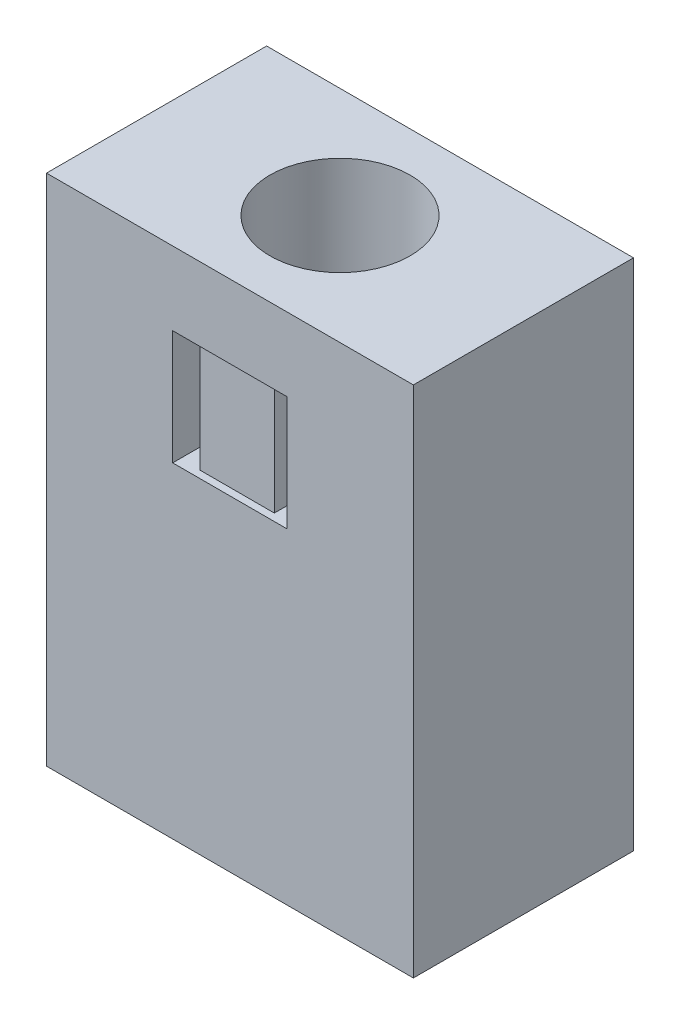
ISO-10303-21;
HEADER;
FILE_DESCRIPTION(('STEP AP214'),'2;1');
FILE_NAME('part.step','',(''),(''),'','','');
FILE_SCHEMA(('AUTOMOTIVE_DESIGN { 1 0 10303 214 1 1 1 1 }'));
ENDSEC;
DATA;
#1=APPLICATION_CONTEXT('core data for automotive mechanical design processes');
#2=APPLICATION_PROTOCOL_DEFINITION('international standard','automotive_design',2000,#1);
#3=PRODUCT_CONTEXT('',#1,'mechanical');
#4=PRODUCT('Part','Part','',(#3));
#5=PRODUCT_RELATED_PRODUCT_CATEGORY('part','',(#4));
#6=PRODUCT_DEFINITION_FORMATION('','',#4);
#7=PRODUCT_DEFINITION_CONTEXT('part definition',#1,'design');
#8=PRODUCT_DEFINITION('design','',#6,#7);
#9=PRODUCT_DEFINITION_SHAPE('','',#8);
#10=(LENGTH_UNIT() NAMED_UNIT(*) SI_UNIT(.MILLI.,.METRE.));
#11=(NAMED_UNIT(*) PLANE_ANGLE_UNIT() SI_UNIT($,.RADIAN.));
#12=(NAMED_UNIT(*) SI_UNIT($,.STERADIAN.) SOLID_ANGLE_UNIT());
#13=UNCERTAINTY_MEASURE_WITH_UNIT(LENGTH_MEASURE(1.E-05),#10,'distance_accuracy_value','');
#14=(GEOMETRIC_REPRESENTATION_CONTEXT(3) GLOBAL_UNCERTAINTY_ASSIGNED_CONTEXT((#13)) GLOBAL_UNIT_ASSIGNED_CONTEXT((#10,
#11,#12)) REPRESENTATION_CONTEXT('',''));
#15=CARTESIAN_POINT('',(0.,0.,0.));
#16=DIRECTION('',(0.,0.,1.));
#17=DIRECTION('',(1.,0.,0.));
#18=AXIS2_PLACEMENT_3D('',#15,#16,#17);
#19=CARTESIAN_POINT('',(0.,0.,14.));
#20=DIRECTION('',(0.,0.,-1.));
#21=DIRECTION('',(-1.,0.,0.));
#22=AXIS2_PLACEMENT_3D('',#19,#20,#21);
#23=PLANE('',#22);
#24=DIRECTION('',(0.,-1.,0.));
#25=VECTOR('',#24,1.);
#26=CARTESIAN_POINT('',(5.05000000000001,60.,14.));
#27=LINE('',#26,#25);
#28=CARTESIAN_POINT('',(5.05000000000001,60.,14.));
#29=VERTEX_POINT('',#28);
#30=CARTESIAN_POINT('',(5.05000000000001,44.4,14.));
#31=VERTEX_POINT('',#30);
#32=EDGE_CURVE('E165',#29,#31,#27,.T.);
#33=ORIENTED_EDGE('',*,*,#32,.F.);
#34=DIRECTION('',(-1.,0.,0.));
#35=VECTOR('',#34,1.);
#36=CARTESIAN_POINT('',(-7.80000000000001,60.,14.));
#37=LINE('',#36,#35);
#38=CARTESIAN_POINT('',(-5.04999999999999,60.,14.));
#39=VERTEX_POINT('',#38);
#40=EDGE_CURVE('E204',#29,#39,#37,.T.);
#41=ORIENTED_EDGE('',*,*,#40,.T.);
#42=DIRECTION('',(0.,1.,0.));
#43=VECTOR('',#42,1.);
#44=CARTESIAN_POINT('',(-5.04999999999999,60.,14.));
#45=LINE('',#44,#43);
#46=CARTESIAN_POINT('',(-5.04999999999999,44.4,14.));
#47=VERTEX_POINT('',#46);
#48=EDGE_CURVE('E168',#47,#39,#45,.T.);
#49=ORIENTED_EDGE('',*,*,#48,.F.);
#50=DIRECTION('',(1.,0.,0.));
#51=VECTOR('',#50,1.);
#52=CARTESIAN_POINT('',(-7.80000000000001,44.4,14.));
#53=LINE('',#52,#51);
#54=EDGE_CURVE('E208',#47,#31,#53,.T.);
#55=ORIENTED_EDGE('',*,*,#54,.T.);
#56=EDGE_LOOP('',(#33,#41,#49,#55));
#57=FACE_BOUND('',#56,.T.);
#58=ADVANCED_FACE('F45',(#57),#23,.F.);
#59=CARTESIAN_POINT('',(25.,70.,15.));
#60=DIRECTION('',(-1.,0.,0.));
#61=DIRECTION('',(0.,0.,1.));
#62=AXIS2_PLACEMENT_3D('',#59,#60,#61);
#63=PLANE('',#62);
#64=DIRECTION('',(0.,0.,-1.));
#65=VECTOR('',#64,1.);
#66=CARTESIAN_POINT('',(25.,0.,15.));
#67=LINE('',#66,#65);
#68=CARTESIAN_POINT('',(25.,0.,15.));
#69=VERTEX_POINT('',#68);
#70=CARTESIAN_POINT('',(25.,0.,-15.));
#71=VERTEX_POINT('',#70);
#72=EDGE_CURVE('E238',#69,#71,#67,.T.);
#73=ORIENTED_EDGE('',*,*,#72,.T.);
#74=DIRECTION('',(0.,-1.,0.));
#75=VECTOR('',#74,1.);
#76=CARTESIAN_POINT('',(25.,70.,-15.));
#77=LINE('',#76,#75);
#78=CARTESIAN_POINT('',(25.,70.,-15.));
#79=VERTEX_POINT('',#78);
#80=EDGE_CURVE('E11',#79,#71,#77,.T.);
#81=ORIENTED_EDGE('',*,*,#80,.F.);
#82=DIRECTION('',(0.,0.,-1.));
#83=VECTOR('',#82,1.);
#84=CARTESIAN_POINT('',(25.,70.,15.));
#85=LINE('',#84,#83);
#86=CARTESIAN_POINT('',(25.,70.,15.));
#87=VERTEX_POINT('',#86);
#88=EDGE_CURVE('E239',#87,#79,#85,.T.);
#89=ORIENTED_EDGE('',*,*,#88,.F.);
#90=DIRECTION('',(0.,-1.,0.));
#91=VECTOR('',#90,1.);
#92=CARTESIAN_POINT('',(25.,70.,15.));
#93=LINE('',#92,#91);
#94=EDGE_CURVE('E253',#87,#69,#93,.T.);
#95=ORIENTED_EDGE('',*,*,#94,.T.);
#96=EDGE_LOOP('',(#73,#81,#89,#95));
#97=FACE_BOUND('',#96,.T.);
#98=ADVANCED_FACE('F47',(#97),#63,.F.);
#99=CARTESIAN_POINT('',(-25.,70.,-15.));
#100=DIRECTION('',(0.,0.,1.));
#101=DIRECTION('',(1.,0.,0.));
#102=AXIS2_PLACEMENT_3D('',#99,#100,#101);
#103=PLANE('',#102);
#104=DIRECTION('',(-1.,0.,0.));
#105=VECTOR('',#104,1.);
#106=CARTESIAN_POINT('',(-25.,0.,-15.));
#107=LINE('',#106,#105);
#108=CARTESIAN_POINT('',(-25.,0.,-15.));
#109=VERTEX_POINT('',#108);
#110=EDGE_CURVE('E257',#71,#109,#107,.T.);
#111=ORIENTED_EDGE('',*,*,#110,.T.);
#112=DIRECTION('',(0.,-1.,0.));
#113=VECTOR('',#112,1.);
#114=CARTESIAN_POINT('',(-25.,70.,-15.));
#115=LINE('',#114,#113);
#116=CARTESIAN_POINT('',(-25.,70.,-15.));
#117=VERTEX_POINT('',#116);
#118=EDGE_CURVE('E54',#117,#109,#115,.T.);
#119=ORIENTED_EDGE('',*,*,#118,.F.);
#120=DIRECTION('',(-1.,0.,0.));
#121=VECTOR('',#120,1.);
#122=CARTESIAN_POINT('',(-25.,70.,-15.));
#123=LINE('',#122,#121);
#124=EDGE_CURVE('E243',#79,#117,#123,.T.);
#125=ORIENTED_EDGE('',*,*,#124,.F.);
#126=ORIENTED_EDGE('',*,*,#80,.T.);
#127=EDGE_LOOP('',(#111,#119,#125,#126));
#128=FACE_BOUND('',#127,.T.);
#129=ADVANCED_FACE('F293',(#128),#103,.F.);
#130=CARTESIAN_POINT('',(-25.,70.,15.));
#131=DIRECTION('',(1.,0.,0.));
#132=DIRECTION('',(0.,0.,-1.));
#133=AXIS2_PLACEMENT_3D('',#130,#131,#132);
#134=PLANE('',#133);
#135=DIRECTION('',(0.,0.,1.));
#136=VECTOR('',#135,1.);
#137=CARTESIAN_POINT('',(-25.,0.,15.));
#138=LINE('',#137,#136);
#139=CARTESIAN_POINT('',(-25.,0.,15.));
#140=VERTEX_POINT('',#139);
#141=EDGE_CURVE('E260',#109,#140,#138,.T.);
#142=ORIENTED_EDGE('',*,*,#141,.T.);
#143=DIRECTION('',(0.,-1.,0.));
#144=VECTOR('',#143,1.);
#145=CARTESIAN_POINT('',(-25.,70.,15.));
#146=LINE('',#145,#144);
#147=CARTESIAN_POINT('',(-25.,70.,15.));
#148=VERTEX_POINT('',#147);
#149=EDGE_CURVE('E268',#148,#140,#146,.T.);
#150=ORIENTED_EDGE('',*,*,#149,.F.);
#151=DIRECTION('',(0.,0.,1.));
#152=VECTOR('',#151,1.);
#153=CARTESIAN_POINT('',(-25.,70.,15.));
#154=LINE('',#153,#152);
#155=EDGE_CURVE('E247',#117,#148,#154,.T.);
#156=ORIENTED_EDGE('',*,*,#155,.F.);
#157=ORIENTED_EDGE('',*,*,#118,.T.);
#158=EDGE_LOOP('',(#142,#150,#156,#157));
#159=FACE_BOUND('',#158,.T.);
#160=ADVANCED_FACE('F277',(#159),#134,.F.);
#161=CARTESIAN_POINT('',(-25.,70.,15.));
#162=DIRECTION('',(0.,0.,-1.));
#163=DIRECTION('',(-1.,0.,0.));
#164=AXIS2_PLACEMENT_3D('',#161,#162,#163);
#165=PLANE('',#164);
#166=DIRECTION('',(-1.,0.,0.));
#167=VECTOR('',#166,1.);
#168=CARTESIAN_POINT('',(-7.80000000000001,60.,15.));
#169=LINE('',#168,#167);
#170=CARTESIAN_POINT('',(7.79999999999998,60.,15.));
#171=VERTEX_POINT('',#170);
#172=CARTESIAN_POINT('',(-7.80000000000001,60.,15.));
#173=VERTEX_POINT('',#172);
#174=EDGE_CURVE('E214',#171,#173,#169,.T.);
#175=ORIENTED_EDGE('',*,*,#174,.F.);
#176=DIRECTION('',(0.,1.,0.));
#177=VECTOR('',#176,1.);
#178=CARTESIAN_POINT('',(7.79999999999999,44.4,15.));
#179=LINE('',#178,#177);
#180=CARTESIAN_POINT('',(7.79999999999999,44.4,15.));
#181=VERTEX_POINT('',#180);
#182=EDGE_CURVE('E178',#181,#171,#179,.T.);
#183=ORIENTED_EDGE('',*,*,#182,.F.);
#184=DIRECTION('',(1.,0.,0.));
#185=VECTOR('',#184,1.);
#186=CARTESIAN_POINT('',(-7.80000000000001,44.4,15.));
#187=LINE('',#186,#185);
#188=CARTESIAN_POINT('',(-7.80000000000001,44.4,15.));
#189=VERTEX_POINT('',#188);
#190=EDGE_CURVE('E144',#189,#181,#187,.T.);
#191=ORIENTED_EDGE('',*,*,#190,.F.);
#192=DIRECTION('',(0.,-1.,0.));
#193=VECTOR('',#192,1.);
#194=CARTESIAN_POINT('',(-7.80000000000001,44.4,15.));
#195=LINE('',#194,#193);
#196=EDGE_CURVE('E218',#173,#189,#195,.T.);
#197=ORIENTED_EDGE('',*,*,#196,.F.);
#198=EDGE_LOOP('',(#175,#183,#191,#197));
#199=FACE_BOUND('',#198,.T.);
#200=DIRECTION('',(1.,0.,0.));
#201=VECTOR('',#200,1.);
#202=CARTESIAN_POINT('',(-25.,0.,15.));
#203=LINE('',#202,#201);
#204=EDGE_CURVE('E244',#140,#69,#203,.T.);
#205=ORIENTED_EDGE('',*,*,#204,.T.);
#206=ORIENTED_EDGE('',*,*,#94,.F.);
#207=DIRECTION('',(1.,0.,0.));
#208=VECTOR('',#207,1.);
#209=CARTESIAN_POINT('',(-25.,70.,15.));
#210=LINE('',#209,#208);
#211=EDGE_CURVE('E250',#148,#87,#210,.T.);
#212=ORIENTED_EDGE('',*,*,#211,.F.);
#213=ORIENTED_EDGE('',*,*,#149,.T.);
#214=EDGE_LOOP('',(#205,#206,#212,#213));
#215=FACE_BOUND('',#214,.T.);
#216=ADVANCED_FACE('F286',(#199,#215),#165,.F.);
#217=CARTESIAN_POINT('',(0.,70.,0.));
#218=DIRECTION('',(0.,-1.,0.));
#219=DIRECTION('',(0.,0.,-1.));
#220=AXIS2_PLACEMENT_3D('',#217,#218,#219);
#221=PLANE('',#220);
#222=CARTESIAN_POINT('',(0.,70.,0.));
#223=DIRECTION('',(0.,-1.,0.));
#224=DIRECTION('',(0.,0.,-1.));
#225=AXIS2_PLACEMENT_3D('',#222,#223,#224);
#226=CIRCLE('',#225,9.55);
#227=CARTESIAN_POINT('',(0.,70.,-9.55));
#228=VERTEX_POINT('',#227);
#229=EDGE_CURVE('E234',#228,#228,#226,.T.);
#230=ORIENTED_EDGE('',*,*,#229,.T.);
#231=EDGE_LOOP('',(#230));
#232=FACE_BOUND('',#231,.T.);
#233=ORIENTED_EDGE('',*,*,#88,.T.);
#234=ORIENTED_EDGE('',*,*,#124,.T.);
#235=ORIENTED_EDGE('',*,*,#155,.T.);
#236=ORIENTED_EDGE('',*,*,#211,.T.);
#237=EDGE_LOOP('',(#233,#234,#235,#236));
#238=FACE_BOUND('',#237,.T.);
#239=ADVANCED_FACE('F292',(#232,#238),#221,.F.);
#240=CARTESIAN_POINT('',(0.,0.,0.));
#241=DIRECTION('',(0.,-1.,0.));
#242=DIRECTION('',(0.,0.,-1.));
#243=AXIS2_PLACEMENT_3D('',#240,#241,#242);
#244=PLANE('',#243);
#245=CARTESIAN_POINT('',(0.,0.,0.));
#246=DIRECTION('',(0.,-1.,0.));
#247=DIRECTION('',(0.,0.,-1.));
#248=AXIS2_PLACEMENT_3D('',#245,#246,#247);
#249=CIRCLE('',#248,9.55);
#250=CARTESIAN_POINT('',(0.,0.,-9.55));
#251=VERTEX_POINT('',#250);
#252=EDGE_CURVE('E148',#251,#251,#249,.T.);
#253=ORIENTED_EDGE('',*,*,#252,.F.);
#254=EDGE_LOOP('',(#253));
#255=FACE_BOUND('',#254,.T.);
#256=ORIENTED_EDGE('',*,*,#72,.F.);
#257=ORIENTED_EDGE('',*,*,#204,.F.);
#258=ORIENTED_EDGE('',*,*,#141,.F.);
#259=ORIENTED_EDGE('',*,*,#110,.F.);
#260=EDGE_LOOP('',(#256,#257,#258,#259));
#261=FACE_BOUND('',#260,.T.);
#262=ADVANCED_FACE('F283',(#255,#261),#244,.T.);
#263=CARTESIAN_POINT('',(0.,120.,0.));
#264=DIRECTION('',(0.,-1.,0.));
#265=DIRECTION('',(0.,0.,-1.));
#266=AXIS2_PLACEMENT_3D('',#263,#264,#265);
#267=CYLINDRICAL_SURFACE('',#266,9.55);
#268=ORIENTED_EDGE('',*,*,#252,.T.);
#269=EDGE_LOOP('',(#268));
#270=FACE_BOUND('',#269,.T.);
#271=ORIENTED_EDGE('',*,*,#229,.F.);
#272=EDGE_LOOP('',(#271));
#273=FACE_BOUND('',#272,.T.);
#274=ADVANCED_FACE('F323',(#270,#273),#267,.F.);
#275=CARTESIAN_POINT('',(7.79999999999999,44.4,14.));
#276=DIRECTION('',(1.,0.,0.));
#277=DIRECTION('',(0.,0.,-1.));
#278=AXIS2_PLACEMENT_3D('',#275,#276,#277);
#279=PLANE('',#278);
#280=ORIENTED_EDGE('',*,*,#182,.T.);
#281=DIRECTION('',(0.,0.,1.));
#282=VECTOR('',#281,1.);
#283=CARTESIAN_POINT('',(7.79999999999999,60.,14.));
#284=LINE('',#283,#282);
#285=CARTESIAN_POINT('',(7.79999999999999,60.,11.));
#286=VERTEX_POINT('',#285);
#287=EDGE_CURVE('E155',#286,#171,#284,.T.);
#288=ORIENTED_EDGE('',*,*,#287,.F.);
#289=DIRECTION('',(0.,1.,0.));
#290=VECTOR('',#289,1.);
#291=CARTESIAN_POINT('',(7.79999999999999,60.,11.));
#292=LINE('',#291,#290);
#293=CARTESIAN_POINT('',(7.79999999999999,44.4,11.));
#294=VERTEX_POINT('',#293);
#295=EDGE_CURVE('E152',#294,#286,#292,.T.);
#296=ORIENTED_EDGE('',*,*,#295,.F.);
#297=DIRECTION('',(0.,0.,1.));
#298=VECTOR('',#297,1.);
#299=CARTESIAN_POINT('',(7.79999999999999,44.4,14.));
#300=LINE('',#299,#298);
#301=EDGE_CURVE('E137',#294,#181,#300,.T.);
#302=ORIENTED_EDGE('',*,*,#301,.T.);
#303=EDGE_LOOP('',(#280,#288,#296,#302));
#304=FACE_BOUND('',#303,.T.);
#305=ADVANCED_FACE('F153',(#304),#279,.F.);
#306=CARTESIAN_POINT('',(-7.80000000000001,44.4,14.));
#307=DIRECTION('',(0.,-1.,0.));
#308=DIRECTION('',(0.,0.,-1.));
#309=AXIS2_PLACEMENT_3D('',#306,#307,#308);
#310=PLANE('',#309);
#311=ORIENTED_EDGE('',*,*,#190,.T.);
#312=ORIENTED_EDGE('',*,*,#301,.F.);
#313=DIRECTION('',(1.,0.,0.));
#314=VECTOR('',#313,1.);
#315=CARTESIAN_POINT('',(5.05000000000001,44.4,11.));
#316=LINE('',#315,#314);
#317=CARTESIAN_POINT('',(5.05000000000001,44.4,11.));
#318=VERTEX_POINT('',#317);
#319=EDGE_CURVE('E141',#318,#294,#316,.T.);
#320=ORIENTED_EDGE('',*,*,#319,.F.);
#321=DIRECTION('',(0.,0.,1.));
#322=VECTOR('',#321,1.);
#323=CARTESIAN_POINT('',(5.05000000000001,44.4,11.));
#324=LINE('',#323,#322);
#325=EDGE_CURVE('E175',#318,#31,#324,.T.);
#326=ORIENTED_EDGE('',*,*,#325,.T.);
#327=ORIENTED_EDGE('',*,*,#54,.F.);
#328=DIRECTION('',(0.,0.,1.));
#329=VECTOR('',#328,1.);
#330=CARTESIAN_POINT('',(-5.04999999999999,44.4,11.));
#331=LINE('',#330,#329);
#332=CARTESIAN_POINT('',(-5.04999999999999,44.4,11.));
#333=VERTEX_POINT('',#332);
#334=EDGE_CURVE('E61',#333,#47,#331,.T.);
#335=ORIENTED_EDGE('',*,*,#334,.F.);
#336=DIRECTION('',(1.,0.,0.));
#337=VECTOR('',#336,1.);
#338=CARTESIAN_POINT('',(-7.80000000000001,44.4,11.));
#339=LINE('',#338,#337);
#340=CARTESIAN_POINT('',(-7.80000000000001,44.4,11.));
#341=VERTEX_POINT('',#340);
#342=EDGE_CURVE('E193',#341,#333,#339,.T.);
#343=ORIENTED_EDGE('',*,*,#342,.F.);
#344=DIRECTION('',(0.,0.,1.));
#345=VECTOR('',#344,1.);
#346=CARTESIAN_POINT('',(-7.80000000000001,44.4,14.));
#347=LINE('',#346,#345);
#348=EDGE_CURVE('E149',#341,#189,#347,.T.);
#349=ORIENTED_EDGE('',*,*,#348,.T.);
#350=EDGE_LOOP('',(#311,#312,#320,#326,#327,#335,#343,#349));
#351=FACE_BOUND('',#350,.T.);
#352=ADVANCED_FACE('F139',(#351),#310,.F.);
#353=CARTESIAN_POINT('',(-7.80000000000001,44.4,14.));
#354=DIRECTION('',(-1.,0.,0.));
#355=DIRECTION('',(0.,0.,1.));
#356=AXIS2_PLACEMENT_3D('',#353,#354,#355);
#357=PLANE('',#356);
#358=ORIENTED_EDGE('',*,*,#196,.T.);
#359=ORIENTED_EDGE('',*,*,#348,.F.);
#360=DIRECTION('',(0.,-1.,0.));
#361=VECTOR('',#360,1.);
#362=CARTESIAN_POINT('',(-7.80000000000001,60.,11.));
#363=LINE('',#362,#361);
#364=CARTESIAN_POINT('',(-7.80000000000001,60.,11.));
#365=VERTEX_POINT('',#364);
#366=EDGE_CURVE('E197',#365,#341,#363,.T.);
#367=ORIENTED_EDGE('',*,*,#366,.F.);
#368=DIRECTION('',(0.,0.,1.));
#369=VECTOR('',#368,1.);
#370=CARTESIAN_POINT('',(-7.80000000000001,60.,14.));
#371=LINE('',#370,#369);
#372=EDGE_CURVE('E226',#365,#173,#371,.T.);
#373=ORIENTED_EDGE('',*,*,#372,.T.);
#374=EDGE_LOOP('',(#358,#359,#367,#373));
#375=FACE_BOUND('',#374,.T.);
#376=ADVANCED_FACE('F313',(#375),#357,.F.);
#377=CARTESIAN_POINT('',(-7.80000000000001,60.,14.));
#378=DIRECTION('',(0.,1.,0.));
#379=DIRECTION('',(0.,0.,1.));
#380=AXIS2_PLACEMENT_3D('',#377,#378,#379);
#381=PLANE('',#380);
#382=ORIENTED_EDGE('',*,*,#174,.T.);
#383=ORIENTED_EDGE('',*,*,#372,.F.);
#384=DIRECTION('',(-1.,0.,0.));
#385=VECTOR('',#384,1.);
#386=CARTESIAN_POINT('',(-7.80000000000001,60.,11.));
#387=LINE('',#386,#385);
#388=CARTESIAN_POINT('',(-5.04999999999999,60.,11.));
#389=VERTEX_POINT('',#388);
#390=EDGE_CURVE('E189',#389,#365,#387,.T.);
#391=ORIENTED_EDGE('',*,*,#390,.F.);
#392=DIRECTION('',(0.,0.,1.));
#393=VECTOR('',#392,1.);
#394=CARTESIAN_POINT('',(-5.04999999999999,60.,11.));
#395=LINE('',#394,#393);
#396=EDGE_CURVE('E184',#389,#39,#395,.T.);
#397=ORIENTED_EDGE('',*,*,#396,.T.);
#398=ORIENTED_EDGE('',*,*,#40,.F.);
#399=DIRECTION('',(0.,0.,1.));
#400=VECTOR('',#399,1.);
#401=CARTESIAN_POINT('',(5.05000000000001,60.,11.));
#402=LINE('',#401,#400);
#403=CARTESIAN_POINT('',(5.05000000000001,60.,11.));
#404=VERTEX_POINT('',#403);
#405=EDGE_CURVE('E69',#404,#29,#402,.T.);
#406=ORIENTED_EDGE('',*,*,#405,.F.);
#407=DIRECTION('',(-1.,0.,0.));
#408=VECTOR('',#407,1.);
#409=CARTESIAN_POINT('',(5.05000000000001,60.,11.));
#410=LINE('',#409,#408);
#411=EDGE_CURVE('E160',#286,#404,#410,.T.);
#412=ORIENTED_EDGE('',*,*,#411,.F.);
#413=ORIENTED_EDGE('',*,*,#287,.T.);
#414=EDGE_LOOP('',(#382,#383,#391,#397,#398,#406,#412,#413));
#415=FACE_BOUND('',#414,.T.);
#416=ADVANCED_FACE('F316',(#415),#381,.F.);
#417=CARTESIAN_POINT('',(-5.04999999999999,60.,11.));
#418=DIRECTION('',(1.,0.,0.));
#419=DIRECTION('',(0.,1.,0.));
#420=AXIS2_PLACEMENT_3D('',#417,#418,#419);
#421=PLANE('',#420);
#422=ORIENTED_EDGE('',*,*,#48,.T.);
#423=ORIENTED_EDGE('',*,*,#396,.F.);
#424=DIRECTION('',(0.,1.,0.));
#425=VECTOR('',#424,1.);
#426=CARTESIAN_POINT('',(-5.04999999999999,60.,11.));
#427=LINE('',#426,#425);
#428=EDGE_CURVE('E183',#333,#389,#427,.T.);
#429=ORIENTED_EDGE('',*,*,#428,.F.);
#430=ORIENTED_EDGE('',*,*,#334,.T.);
#431=EDGE_LOOP('',(#422,#423,#429,#430));
#432=FACE_BOUND('',#431,.T.);
#433=ADVANCED_FACE('F320',(#432),#421,.F.);
#434=CARTESIAN_POINT('',(0.,0.,11.));
#435=DIRECTION('',(0.,0.,-1.));
#436=DIRECTION('',(-1.,0.,0.));
#437=AXIS2_PLACEMENT_3D('',#434,#435,#436);
#438=PLANE('',#437);
#439=ORIENTED_EDGE('',*,*,#390,.T.);
#440=ORIENTED_EDGE('',*,*,#366,.T.);
#441=ORIENTED_EDGE('',*,*,#342,.T.);
#442=ORIENTED_EDGE('',*,*,#428,.T.);
#443=EDGE_LOOP('',(#439,#440,#441,#442));
#444=FACE_BOUND('',#443,.T.);
#445=ADVANCED_FACE('F309',(#444),#438,.F.);
#446=CARTESIAN_POINT('',(5.05000000000001,60.,11.));
#447=DIRECTION('',(-1.,0.,0.));
#448=DIRECTION('',(0.,-1.,0.));
#449=AXIS2_PLACEMENT_3D('',#446,#447,#448);
#450=PLANE('',#449);
#451=ORIENTED_EDGE('',*,*,#32,.T.);
#452=ORIENTED_EDGE('',*,*,#325,.F.);
#453=DIRECTION('',(0.,-1.,0.));
#454=VECTOR('',#453,1.);
#455=CARTESIAN_POINT('',(5.05000000000001,60.,11.));
#456=LINE('',#455,#454);
#457=EDGE_CURVE('E163',#404,#318,#456,.T.);
#458=ORIENTED_EDGE('',*,*,#457,.F.);
#459=ORIENTED_EDGE('',*,*,#405,.T.);
#460=EDGE_LOOP('',(#451,#452,#458,#459));
#461=FACE_BOUND('',#460,.T.);
#462=ADVANCED_FACE('F341',(#461),#450,.F.);
#463=CARTESIAN_POINT('',(0.,0.,11.));
#464=DIRECTION('',(0.,0.,-1.));
#465=DIRECTION('',(-1.,0.,0.));
#466=AXIS2_PLACEMENT_3D('',#463,#464,#465);
#467=PLANE('',#466);
#468=ORIENTED_EDGE('',*,*,#319,.T.);
#469=ORIENTED_EDGE('',*,*,#295,.T.);
#470=ORIENTED_EDGE('',*,*,#411,.T.);
#471=ORIENTED_EDGE('',*,*,#457,.T.);
#472=EDGE_LOOP('',(#468,#469,#470,#471));
#473=FACE_BOUND('',#472,.T.);
#474=ADVANCED_FACE('F162',(#473),#467,.F.);
#475=CLOSED_SHELL('',(#58,#98,#129,#160,#216,#239,#262,#274,#305,#352,#376,#416,#433,#445,#462,#474));
#476=MANIFOLD_SOLID_BREP('B2',#475);
#477=ADVANCED_BREP_SHAPE_REPRESENTATION('',(#18,#476),#14);
#478=SHAPE_DEFINITION_REPRESENTATION(#9,#477);
ENDSEC;
END-ISO-10303-21;
